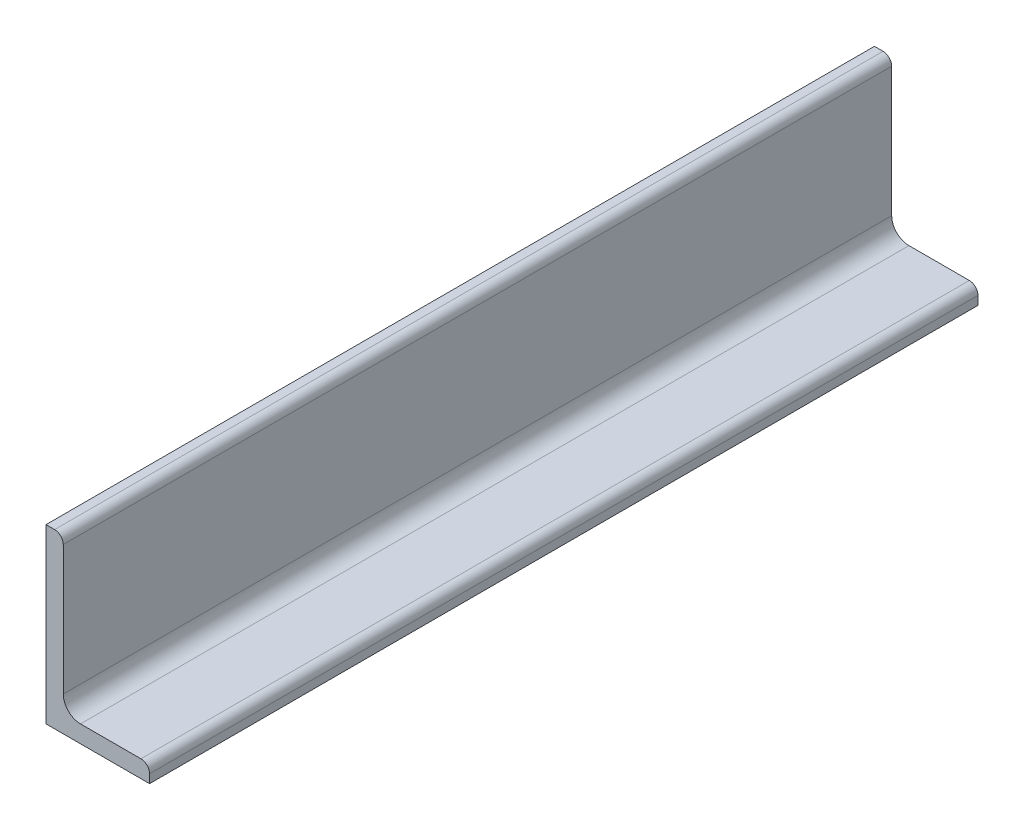
ISO-10303-21;
HEADER;
FILE_DESCRIPTION(('STEP AP214'),'2;1');
FILE_NAME('part.step','',(''),(''),'','','');
FILE_SCHEMA(('AUTOMOTIVE_DESIGN { 1 0 10303 214 1 1 1 1 }'));
ENDSEC;
DATA;
#1=APPLICATION_CONTEXT('core data for automotive mechanical design processes');
#2=APPLICATION_PROTOCOL_DEFINITION('international standard','automotive_design',2000,#1);
#3=PRODUCT_CONTEXT('',#1,'mechanical');
#4=PRODUCT('Part','Part','',(#3));
#5=PRODUCT_RELATED_PRODUCT_CATEGORY('part','',(#4));
#6=PRODUCT_DEFINITION_FORMATION('','',#4);
#7=PRODUCT_DEFINITION_CONTEXT('part definition',#1,'design');
#8=PRODUCT_DEFINITION('design','',#6,#7);
#9=PRODUCT_DEFINITION_SHAPE('','',#8);
#10=(LENGTH_UNIT() NAMED_UNIT(*) SI_UNIT(.MILLI.,.METRE.));
#11=(NAMED_UNIT(*) PLANE_ANGLE_UNIT() SI_UNIT($,.RADIAN.));
#12=(NAMED_UNIT(*) SI_UNIT($,.STERADIAN.) SOLID_ANGLE_UNIT());
#13=UNCERTAINTY_MEASURE_WITH_UNIT(LENGTH_MEASURE(1.E-05),#10,'distance_accuracy_value','');
#14=(GEOMETRIC_REPRESENTATION_CONTEXT(3) GLOBAL_UNCERTAINTY_ASSIGNED_CONTEXT((#13)) GLOBAL_UNIT_ASSIGNED_CONTEXT((#10,
#11,#12)) REPRESENTATION_CONTEXT('',''));
#15=CARTESIAN_POINT('',(0.,0.,0.));
#16=DIRECTION('',(0.,0.,1.));
#17=DIRECTION('',(1.,0.,0.));
#18=AXIS2_PLACEMENT_3D('',#15,#16,#17);
#19=CARTESIAN_POINT('',(0.523658184719261,63.8534276781816,304.8));
#20=DIRECTION('',(1.,0.,0.));
#21=DIRECTION('',(0.,0.,-1.));
#22=AXIS2_PLACEMENT_3D('',#19,#20,#21);
#23=PLANE('',#22);
#24=DIRECTION('',(0.,-1.,0.));
#25=VECTOR('',#24,1.);
#26=CARTESIAN_POINT('',(0.523658184719261,63.8534276781816,0.));
#27=LINE('',#26,#25);
#28=CARTESIAN_POINT('',(0.523658184719261,63.8534276781816,0.));
#29=VERTEX_POINT('',#28);
#30=CARTESIAN_POINT('',(0.523658184719261,0.353427678181561,0.));
#31=VERTEX_POINT('',#30);
#32=EDGE_CURVE('E139',#29,#31,#27,.T.);
#33=ORIENTED_EDGE('',*,*,#32,.T.);
#34=DIRECTION('',(0.,0.,-1.));
#35=VECTOR('',#34,1.);
#36=CARTESIAN_POINT('',(0.523658184719261,0.353427678181561,304.8));
#37=LINE('',#36,#35);
#38=CARTESIAN_POINT('',(0.523658184719261,0.353427678181561,304.8));
#39=VERTEX_POINT('',#38);
#40=EDGE_CURVE('E11',#39,#31,#37,.T.);
#41=ORIENTED_EDGE('',*,*,#40,.F.);
#42=DIRECTION('',(0.,-1.,0.));
#43=VECTOR('',#42,1.);
#44=CARTESIAN_POINT('',(0.523658184719261,63.8534276781816,304.8));
#45=LINE('',#44,#43);
#46=CARTESIAN_POINT('',(0.523658184719261,63.8534276781816,304.8));
#47=VERTEX_POINT('',#46);
#48=EDGE_CURVE('E155',#47,#39,#45,.T.);
#49=ORIENTED_EDGE('',*,*,#48,.F.);
#50=DIRECTION('',(0.,0.,-1.));
#51=VECTOR('',#50,1.);
#52=CARTESIAN_POINT('',(0.523658184719261,63.8534276781816,304.8));
#53=LINE('',#52,#51);
#54=EDGE_CURVE('E135',#47,#29,#53,.T.);
#55=ORIENTED_EDGE('',*,*,#54,.T.);
#56=EDGE_LOOP('',(#33,#41,#49,#55));
#57=FACE_BOUND('',#56,.T.);
#58=ADVANCED_FACE('F37',(#57),#23,.F.);
#59=CARTESIAN_POINT('',(0.523658184719261,0.353427678181561,304.8));
#60=DIRECTION('',(0.,1.,0.));
#61=DIRECTION('',(0.,0.,1.));
#62=AXIS2_PLACEMENT_3D('',#59,#60,#61);
#63=PLANE('',#62);
#64=DIRECTION('',(1.,0.,0.));
#65=VECTOR('',#64,1.);
#66=CARTESIAN_POINT('',(0.523658184719261,0.353427678181561,0.));
#67=LINE('',#66,#65);
#68=CARTESIAN_POINT('',(38.6236581847193,0.353427678181561,0.));
#69=VERTEX_POINT('',#68);
#70=EDGE_CURVE('E142',#31,#69,#67,.T.);
#71=ORIENTED_EDGE('',*,*,#70,.T.);
#72=DIRECTION('',(0.,0.,-1.));
#73=VECTOR('',#72,1.);
#74=CARTESIAN_POINT('',(38.6236581847193,0.353427678181561,304.8));
#75=LINE('',#74,#73);
#76=CARTESIAN_POINT('',(38.6236581847193,0.353427678181561,304.8));
#77=VERTEX_POINT('',#76);
#78=EDGE_CURVE('E45',#77,#69,#75,.T.);
#79=ORIENTED_EDGE('',*,*,#78,.F.);
#80=DIRECTION('',(1.,0.,0.));
#81=VECTOR('',#80,1.);
#82=CARTESIAN_POINT('',(0.523658184719261,0.353427678181561,304.8));
#83=LINE('',#82,#81);
#84=EDGE_CURVE('E99',#39,#77,#83,.T.);
#85=ORIENTED_EDGE('',*,*,#84,.F.);
#86=ORIENTED_EDGE('',*,*,#40,.T.);
#87=EDGE_LOOP('',(#71,#79,#85,#86));
#88=FACE_BOUND('',#87,.T.);
#89=ADVANCED_FACE('F198',(#88),#63,.F.);
#90=CARTESIAN_POINT('',(38.6236581847193,0.353427678181561,304.8));
#91=DIRECTION('',(-1.,0.,0.));
#92=DIRECTION('',(0.,0.,1.));
#93=AXIS2_PLACEMENT_3D('',#90,#91,#92);
#94=PLANE('',#93);
#95=DIRECTION('',(0.,1.,0.));
#96=VECTOR('',#95,1.);
#97=CARTESIAN_POINT('',(38.6236581847193,0.353427678181561,0.));
#98=LINE('',#97,#96);
#99=CARTESIAN_POINT('',(38.6236581847193,3.52842767818156,0.));
#100=VERTEX_POINT('',#99);
#101=EDGE_CURVE('E144',#69,#100,#98,.T.);
#102=ORIENTED_EDGE('',*,*,#101,.T.);
#103=DIRECTION('',(0.,0.,-1.));
#104=VECTOR('',#103,1.);
#105=CARTESIAN_POINT('',(38.6236581847193,3.52842767818156,304.8));
#106=LINE('',#105,#104);
#107=CARTESIAN_POINT('',(38.6236581847193,3.52842767818156,304.8));
#108=VERTEX_POINT('',#107);
#109=EDGE_CURVE('E165',#108,#100,#106,.T.);
#110=ORIENTED_EDGE('',*,*,#109,.F.);
#111=DIRECTION('',(0.,1.,0.));
#112=VECTOR('',#111,1.);
#113=CARTESIAN_POINT('',(38.6236581847193,0.353427678181561,304.8));
#114=LINE('',#113,#112);
#115=EDGE_CURVE('E173',#77,#108,#114,.T.);
#116=ORIENTED_EDGE('',*,*,#115,.F.);
#117=ORIENTED_EDGE('',*,*,#78,.T.);
#118=EDGE_LOOP('',(#102,#110,#116,#117));
#119=FACE_BOUND('',#118,.T.);
#120=ADVANCED_FACE('F171',(#119),#94,.F.);
#121=CARTESIAN_POINT('',(35.4486581847193,3.52842767818156,304.8));
#122=DIRECTION('',(0.,0.,-1.));
#123=DIRECTION('',(-1.,0.,0.));
#124=AXIS2_PLACEMENT_3D('',#121,#122,#123);
#125=CYLINDRICAL_SURFACE('',#124,3.175);
#126=CARTESIAN_POINT('',(35.4486581847193,3.52842767818156,0.));
#127=DIRECTION('',(0.,0.,1.));
#128=DIRECTION('',(1.,0.,0.));
#129=AXIS2_PLACEMENT_3D('',#126,#127,#128);
#130=CIRCLE('',#129,3.175);
#131=CARTESIAN_POINT('',(35.4486581847193,6.70342767818156,0.));
#132=VERTEX_POINT('',#131);
#133=EDGE_CURVE('E146',#100,#132,#130,.T.);
#134=ORIENTED_EDGE('',*,*,#133,.T.);
#135=DIRECTION('',(0.,0.,-1.));
#136=VECTOR('',#135,1.);
#137=CARTESIAN_POINT('',(35.4486581847193,6.70342767818156,304.8));
#138=LINE('',#137,#136);
#139=CARTESIAN_POINT('',(35.4486581847193,6.70342767818156,304.8));
#140=VERTEX_POINT('',#139);
#141=EDGE_CURVE('E162',#140,#132,#138,.T.);
#142=ORIENTED_EDGE('',*,*,#141,.F.);
#143=CARTESIAN_POINT('',(35.4486581847193,3.52842767818156,304.8));
#144=DIRECTION('',(0.,0.,1.));
#145=DIRECTION('',(1.,0.,0.));
#146=AXIS2_PLACEMENT_3D('',#143,#144,#145);
#147=CIRCLE('',#146,3.175);
#148=EDGE_CURVE('E189',#108,#140,#147,.T.);
#149=ORIENTED_EDGE('',*,*,#148,.F.);
#150=ORIENTED_EDGE('',*,*,#109,.T.);
#151=EDGE_LOOP('',(#134,#142,#149,#150));
#152=FACE_BOUND('',#151,.T.);
#153=ADVANCED_FACE('F182',(#152),#125,.T.);
#154=CARTESIAN_POINT('',(35.4486581847193,6.70342767818156,304.8));
#155=DIRECTION('',(0.,-1.,0.));
#156=DIRECTION('',(0.,0.,-1.));
#157=AXIS2_PLACEMENT_3D('',#154,#155,#156);
#158=PLANE('',#157);
#159=DIRECTION('',(-1.,0.,0.));
#160=VECTOR('',#159,1.);
#161=CARTESIAN_POINT('',(35.4486581847193,6.70342767818156,0.));
#162=LINE('',#161,#160);
#163=CARTESIAN_POINT('',(13.2236581847193,6.70342767818156,0.));
#164=VERTEX_POINT('',#163);
#165=EDGE_CURVE('E148',#132,#164,#162,.T.);
#166=ORIENTED_EDGE('',*,*,#165,.T.);
#167=DIRECTION('',(0.,0.,-1.));
#168=VECTOR('',#167,1.);
#169=CARTESIAN_POINT('',(13.2236581847193,6.70342767818156,304.8));
#170=LINE('',#169,#168);
#171=CARTESIAN_POINT('',(13.2236581847193,6.70342767818156,304.8));
#172=VERTEX_POINT('',#171);
#173=EDGE_CURVE('E159',#172,#164,#170,.T.);
#174=ORIENTED_EDGE('',*,*,#173,.F.);
#175=DIRECTION('',(-1.,0.,0.));
#176=VECTOR('',#175,1.);
#177=CARTESIAN_POINT('',(35.4486581847193,6.70342767818156,304.8));
#178=LINE('',#177,#176);
#179=EDGE_CURVE('E188',#140,#172,#178,.T.);
#180=ORIENTED_EDGE('',*,*,#179,.F.);
#181=ORIENTED_EDGE('',*,*,#141,.T.);
#182=EDGE_LOOP('',(#166,#174,#180,#181));
#183=FACE_BOUND('',#182,.T.);
#184=ADVANCED_FACE('F186',(#183),#158,.F.);
#185=CARTESIAN_POINT('',(13.2236581847193,13.0534276781816,304.8));
#186=DIRECTION('',(0.,0.,-1.));
#187=DIRECTION('',(-1.,0.,0.));
#188=AXIS2_PLACEMENT_3D('',#185,#186,#187);
#189=CYLINDRICAL_SURFACE('',#188,6.34999999999999);
#190=CARTESIAN_POINT('',(13.2236581847193,13.0534276781816,0.));
#191=DIRECTION('',(0.,0.,-1.));
#192=DIRECTION('',(1.,0.,0.));
#193=AXIS2_PLACEMENT_3D('',#190,#191,#192);
#194=CIRCLE('',#193,6.34999999999999);
#195=CARTESIAN_POINT('',(6.87365818471926,13.0534276781816,0.));
#196=VERTEX_POINT('',#195);
#197=EDGE_CURVE('E150',#164,#196,#194,.T.);
#198=ORIENTED_EDGE('',*,*,#197,.T.);
#199=DIRECTION('',(0.,0.,-1.));
#200=VECTOR('',#199,1.);
#201=CARTESIAN_POINT('',(6.87365818471926,13.0534276781816,304.8));
#202=LINE('',#201,#200);
#203=CARTESIAN_POINT('',(6.87365818471926,13.0534276781816,304.8));
#204=VERTEX_POINT('',#203);
#205=EDGE_CURVE('E130',#204,#196,#202,.T.);
#206=ORIENTED_EDGE('',*,*,#205,.F.);
#207=CARTESIAN_POINT('',(13.2236581847193,13.0534276781816,304.8));
#208=DIRECTION('',(0.,0.,-1.));
#209=DIRECTION('',(1.,0.,0.));
#210=AXIS2_PLACEMENT_3D('',#207,#208,#209);
#211=CIRCLE('',#210,6.34999999999999);
#212=EDGE_CURVE('E121',#172,#204,#211,.T.);
#213=ORIENTED_EDGE('',*,*,#212,.F.);
#214=ORIENTED_EDGE('',*,*,#173,.T.);
#215=EDGE_LOOP('',(#198,#206,#213,#214));
#216=FACE_BOUND('',#215,.T.);
#217=ADVANCED_FACE('F210',(#216),#189,.F.);
#218=CARTESIAN_POINT('',(6.87365818471926,13.0534276781816,304.8));
#219=DIRECTION('',(-1.,0.,0.));
#220=DIRECTION('',(0.,0.,1.));
#221=AXIS2_PLACEMENT_3D('',#218,#219,#220);
#222=PLANE('',#221);
#223=DIRECTION('',(0.,1.,0.));
#224=VECTOR('',#223,1.);
#225=CARTESIAN_POINT('',(6.87365818471926,13.0534276781816,0.));
#226=LINE('',#225,#224);
#227=CARTESIAN_POINT('',(6.87365818471926,60.6784276781816,0.));
#228=VERTEX_POINT('',#227);
#229=EDGE_CURVE('E129',#196,#228,#226,.T.);
#230=ORIENTED_EDGE('',*,*,#229,.T.);
#231=DIRECTION('',(0.,0.,-1.));
#232=VECTOR('',#231,1.);
#233=CARTESIAN_POINT('',(6.87365818471926,60.6784276781816,304.8));
#234=LINE('',#233,#232);
#235=CARTESIAN_POINT('',(6.87365818471926,60.6784276781816,304.8));
#236=VERTEX_POINT('',#235);
#237=EDGE_CURVE('E126',#236,#228,#234,.T.);
#238=ORIENTED_EDGE('',*,*,#237,.F.);
#239=DIRECTION('',(0.,1.,0.));
#240=VECTOR('',#239,1.);
#241=CARTESIAN_POINT('',(6.87365818471926,13.0534276781816,304.8));
#242=LINE('',#241,#240);
#243=EDGE_CURVE('E115',#204,#236,#242,.T.);
#244=ORIENTED_EDGE('',*,*,#243,.F.);
#245=ORIENTED_EDGE('',*,*,#205,.T.);
#246=EDGE_LOOP('',(#230,#238,#244,#245));
#247=FACE_BOUND('',#246,.T.);
#248=ADVANCED_FACE('F127',(#247),#222,.F.);
#249=CARTESIAN_POINT('',(3.69865818471926,60.6784276781816,304.8));
#250=DIRECTION('',(0.,0.,-1.));
#251=DIRECTION('',(-1.,0.,0.));
#252=AXIS2_PLACEMENT_3D('',#249,#250,#251);
#253=CYLINDRICAL_SURFACE('',#252,3.175);
#254=CARTESIAN_POINT('',(3.69865818471926,60.6784276781816,0.));
#255=DIRECTION('',(0.,0.,1.));
#256=DIRECTION('',(1.,0.,0.));
#257=AXIS2_PLACEMENT_3D('',#254,#255,#256);
#258=CIRCLE('',#257,3.175);
#259=CARTESIAN_POINT('',(3.69865818471926,63.8534276781816,0.));
#260=VERTEX_POINT('',#259);
#261=EDGE_CURVE('E85',#228,#260,#258,.T.);
#262=ORIENTED_EDGE('',*,*,#261,.T.);
#263=DIRECTION('',(0.,0.,-1.));
#264=VECTOR('',#263,1.);
#265=CARTESIAN_POINT('',(3.69865818471926,63.8534276781816,304.8));
#266=LINE('',#265,#264);
#267=CARTESIAN_POINT('',(3.69865818471926,63.8534276781816,304.8));
#268=VERTEX_POINT('',#267);
#269=EDGE_CURVE('E131',#268,#260,#266,.T.);
#270=ORIENTED_EDGE('',*,*,#269,.F.);
#271=CARTESIAN_POINT('',(3.69865818471926,60.6784276781816,304.8));
#272=DIRECTION('',(0.,0.,1.));
#273=DIRECTION('',(1.,0.,0.));
#274=AXIS2_PLACEMENT_3D('',#271,#272,#273);
#275=CIRCLE('',#274,3.175);
#276=EDGE_CURVE('E119',#236,#268,#275,.T.);
#277=ORIENTED_EDGE('',*,*,#276,.F.);
#278=ORIENTED_EDGE('',*,*,#237,.T.);
#279=EDGE_LOOP('',(#262,#270,#277,#278));
#280=FACE_BOUND('',#279,.T.);
#281=ADVANCED_FACE('F133',(#280),#253,.T.);
#282=CARTESIAN_POINT('',(3.69865818471926,63.8534276781816,304.8));
#283=DIRECTION('',(0.,-1.,0.));
#284=DIRECTION('',(0.,0.,-1.));
#285=AXIS2_PLACEMENT_3D('',#282,#283,#284);
#286=PLANE('',#285);
#287=DIRECTION('',(-1.,0.,0.));
#288=VECTOR('',#287,1.);
#289=CARTESIAN_POINT('',(3.69865818471926,63.8534276781816,0.));
#290=LINE('',#289,#288);
#291=EDGE_CURVE('E91',#260,#29,#290,.T.);
#292=ORIENTED_EDGE('',*,*,#291,.T.);
#293=ORIENTED_EDGE('',*,*,#54,.F.);
#294=DIRECTION('',(-1.,0.,0.));
#295=VECTOR('',#294,1.);
#296=CARTESIAN_POINT('',(3.69865818471926,63.8534276781816,304.8));
#297=LINE('',#296,#295);
#298=EDGE_CURVE('E53',#268,#47,#297,.T.);
#299=ORIENTED_EDGE('',*,*,#298,.F.);
#300=ORIENTED_EDGE('',*,*,#269,.T.);
#301=EDGE_LOOP('',(#292,#293,#299,#300));
#302=FACE_BOUND('',#301,.T.);
#303=ADVANCED_FACE('F218',(#302),#286,.F.);
#304=CARTESIAN_POINT('',(35.4486581847193,3.52842767818156,304.8));
#305=DIRECTION('',(0.,0.,1.));
#306=DIRECTION('',(1.,0.,0.));
#307=AXIS2_PLACEMENT_3D('',#304,#305,#306);
#308=PLANE('',#307);
#309=ORIENTED_EDGE('',*,*,#48,.T.);
#310=ORIENTED_EDGE('',*,*,#84,.T.);
#311=ORIENTED_EDGE('',*,*,#115,.T.);
#312=ORIENTED_EDGE('',*,*,#148,.T.);
#313=ORIENTED_EDGE('',*,*,#179,.T.);
#314=ORIENTED_EDGE('',*,*,#212,.T.);
#315=ORIENTED_EDGE('',*,*,#243,.T.);
#316=ORIENTED_EDGE('',*,*,#276,.T.);
#317=ORIENTED_EDGE('',*,*,#298,.T.);
#318=EDGE_LOOP('',(#309,#310,#311,#312,#313,#314,#315,#316,#317));
#319=FACE_BOUND('',#318,.T.);
#320=ADVANCED_FACE('F117',(#319),#308,.T.);
#321=CARTESIAN_POINT('',(35.4486581847193,3.52842767818156,0.));
#322=DIRECTION('',(0.,0.,1.));
#323=DIRECTION('',(1.,0.,0.));
#324=AXIS2_PLACEMENT_3D('',#321,#322,#323);
#325=PLANE('',#324);
#326=ORIENTED_EDGE('',*,*,#32,.F.);
#327=ORIENTED_EDGE('',*,*,#291,.F.);
#328=ORIENTED_EDGE('',*,*,#261,.F.);
#329=ORIENTED_EDGE('',*,*,#229,.F.);
#330=ORIENTED_EDGE('',*,*,#197,.F.);
#331=ORIENTED_EDGE('',*,*,#165,.F.);
#332=ORIENTED_EDGE('',*,*,#133,.F.);
#333=ORIENTED_EDGE('',*,*,#101,.F.);
#334=ORIENTED_EDGE('',*,*,#70,.F.);
#335=EDGE_LOOP('',(#326,#327,#328,#329,#330,#331,#332,#333,#334));
#336=FACE_BOUND('',#335,.T.);
#337=ADVANCED_FACE('F177',(#336),#325,.F.);
#338=CLOSED_SHELL('',(#58,#89,#120,#153,#184,#217,#248,#281,#303,#320,#337));
#339=MANIFOLD_SOLID_BREP('B2',#338);
#340=ADVANCED_BREP_SHAPE_REPRESENTATION('',(#18,#339),#14);
#341=SHAPE_DEFINITION_REPRESENTATION(#9,#340);
ENDSEC;
END-ISO-10303-21;
